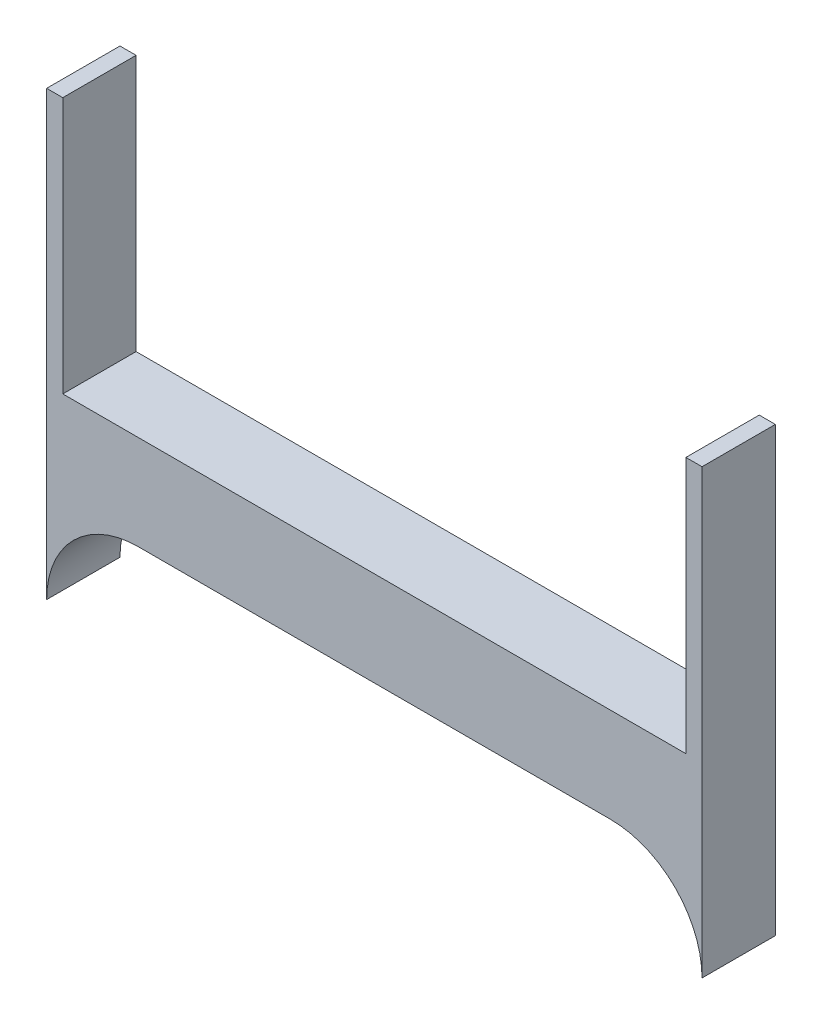
ISO-10303-21;
HEADER;
FILE_DESCRIPTION(('STEP AP214'),'2;1');
FILE_NAME('part.step','',(''),(''),'','','');
FILE_SCHEMA(('AUTOMOTIVE_DESIGN { 1 0 10303 214 1 1 1 1 }'));
ENDSEC;
DATA;
#1=APPLICATION_CONTEXT('core data for automotive mechanical design processes');
#2=APPLICATION_PROTOCOL_DEFINITION('international standard','automotive_design',2000,#1);
#3=PRODUCT_CONTEXT('',#1,'mechanical');
#4=PRODUCT('Part','Part','',(#3));
#5=PRODUCT_RELATED_PRODUCT_CATEGORY('part','',(#4));
#6=PRODUCT_DEFINITION_FORMATION('','',#4);
#7=PRODUCT_DEFINITION_CONTEXT('part definition',#1,'design');
#8=PRODUCT_DEFINITION('design','',#6,#7);
#9=PRODUCT_DEFINITION_SHAPE('','',#8);
#10=(LENGTH_UNIT() NAMED_UNIT(*) SI_UNIT(.MILLI.,.METRE.));
#11=(NAMED_UNIT(*) PLANE_ANGLE_UNIT() SI_UNIT($,.RADIAN.));
#12=(NAMED_UNIT(*) SI_UNIT($,.STERADIAN.) SOLID_ANGLE_UNIT());
#13=UNCERTAINTY_MEASURE_WITH_UNIT(LENGTH_MEASURE(1.E-05),#10,'distance_accuracy_value','');
#14=(GEOMETRIC_REPRESENTATION_CONTEXT(3) GLOBAL_UNCERTAINTY_ASSIGNED_CONTEXT((#13)) GLOBAL_UNIT_ASSIGNED_CONTEXT((#10,
#11,#12)) REPRESENTATION_CONTEXT('',''));
#15=CARTESIAN_POINT('',(0.,0.,0.));
#16=DIRECTION('',(0.,0.,1.));
#17=DIRECTION('',(1.,0.,0.));
#18=AXIS2_PLACEMENT_3D('',#15,#16,#17);
#19=CARTESIAN_POINT('',(1.25,-6.04,1.));
#20=DIRECTION('',(0.,0.,-1.));
#21=DIRECTION('',(-1.,0.,0.));
#22=AXIS2_PLACEMENT_3D('',#19,#20,#21);
#23=CYLINDRICAL_SURFACE('',#22,1.25);
#24=CARTESIAN_POINT('',(1.25,-6.04,0.));
#25=DIRECTION('',(0.,0.,-1.));
#26=DIRECTION('',(1.,0.,0.));
#27=AXIS2_PLACEMENT_3D('',#24,#25,#26);
#28=CIRCLE('',#27,1.25);
#29=CARTESIAN_POINT('',(0.,-6.04,0.));
#30=VERTEX_POINT('',#29);
#31=CARTESIAN_POINT('',(1.25,-4.79,0.));
#32=VERTEX_POINT('',#31);
#33=EDGE_CURVE('E158',#30,#32,#28,.T.);
#34=ORIENTED_EDGE('',*,*,#33,.T.);
#35=DIRECTION('',(0.,0.,-1.));
#36=VECTOR('',#35,1.);
#37=CARTESIAN_POINT('',(1.25,-4.79,1.));
#38=LINE('',#37,#36);
#39=CARTESIAN_POINT('',(1.25,-4.79,1.));
#40=VERTEX_POINT('',#39);
#41=EDGE_CURVE('E11',#40,#32,#38,.T.);
#42=ORIENTED_EDGE('',*,*,#41,.F.);
#43=CARTESIAN_POINT('',(1.25,-6.04,1.));
#44=DIRECTION('',(0.,0.,-1.));
#45=DIRECTION('',(1.,0.,0.));
#46=AXIS2_PLACEMENT_3D('',#43,#44,#45);
#47=CIRCLE('',#46,1.25);
#48=CARTESIAN_POINT('',(0.,-6.04,1.));
#49=VERTEX_POINT('',#48);
#50=EDGE_CURVE('E186',#49,#40,#47,.T.);
#51=ORIENTED_EDGE('',*,*,#50,.F.);
#52=DIRECTION('',(0.,0.,-1.));
#53=VECTOR('',#52,1.);
#54=CARTESIAN_POINT('',(0.,-6.04,1.));
#55=LINE('',#54,#53);
#56=EDGE_CURVE('E154',#49,#30,#55,.T.);
#57=ORIENTED_EDGE('',*,*,#56,.T.);
#58=EDGE_LOOP('',(#34,#42,#51,#57));
#59=FACE_BOUND('',#58,.T.);
#60=ADVANCED_FACE('F45',(#59),#23,.F.);
#61=CARTESIAN_POINT('',(1.25,-4.79,1.));
#62=DIRECTION('',(0.,1.,0.));
#63=DIRECTION('',(-1.,0.,0.));
#64=AXIS2_PLACEMENT_3D('',#61,#62,#63);
#65=PLANE('',#64);
#66=DIRECTION('',(1.,0.,0.));
#67=VECTOR('',#66,1.);
#68=CARTESIAN_POINT('',(1.25,-4.79,0.));
#69=LINE('',#68,#67);
#70=CARTESIAN_POINT('',(7.69,-4.79,0.));
#71=VERTEX_POINT('',#70);
#72=EDGE_CURVE('E162',#32,#71,#69,.T.);
#73=ORIENTED_EDGE('',*,*,#72,.T.);
#74=DIRECTION('',(0.,0.,-1.));
#75=VECTOR('',#74,1.);
#76=CARTESIAN_POINT('',(7.69,-4.79,1.));
#77=LINE('',#76,#75);
#78=CARTESIAN_POINT('',(7.69,-4.79,1.));
#79=VERTEX_POINT('',#78);
#80=EDGE_CURVE('E54',#79,#71,#77,.T.);
#81=ORIENTED_EDGE('',*,*,#80,.F.);
#82=DIRECTION('',(1.,0.,0.));
#83=VECTOR('',#82,1.);
#84=CARTESIAN_POINT('',(1.25,-4.79,1.));
#85=LINE('',#84,#83);
#86=EDGE_CURVE('E111',#40,#79,#85,.T.);
#87=ORIENTED_EDGE('',*,*,#86,.F.);
#88=ORIENTED_EDGE('',*,*,#41,.T.);
#89=EDGE_LOOP('',(#73,#81,#87,#88));
#90=FACE_BOUND('',#89,.T.);
#91=ADVANCED_FACE('F250',(#90),#65,.F.);
#92=CARTESIAN_POINT('',(7.69,-6.04,1.));
#93=DIRECTION('',(0.,0.,-1.));
#94=DIRECTION('',(-1.,0.,0.));
#95=AXIS2_PLACEMENT_3D('',#92,#93,#94);
#96=CYLINDRICAL_SURFACE('',#95,1.25);
#97=CARTESIAN_POINT('',(7.69,-6.04,0.));
#98=DIRECTION('',(0.,0.,-1.));
#99=DIRECTION('',(1.,0.,0.));
#100=AXIS2_PLACEMENT_3D('',#97,#98,#99);
#101=CIRCLE('',#100,1.25);
#102=CARTESIAN_POINT('',(8.94,-6.04,0.));
#103=VERTEX_POINT('',#102);
#104=EDGE_CURVE('E165',#71,#103,#101,.T.);
#105=ORIENTED_EDGE('',*,*,#104,.T.);
#106=DIRECTION('',(0.,0.,-1.));
#107=VECTOR('',#106,1.);
#108=CARTESIAN_POINT('',(8.94,-6.04,1.));
#109=LINE('',#108,#107);
#110=CARTESIAN_POINT('',(8.94,-6.04,1.));
#111=VERTEX_POINT('',#110);
#112=EDGE_CURVE('E205',#111,#103,#109,.T.);
#113=ORIENTED_EDGE('',*,*,#112,.F.);
#114=CARTESIAN_POINT('',(7.69,-6.04,1.));
#115=DIRECTION('',(0.,0.,-1.));
#116=DIRECTION('',(1.,0.,0.));
#117=AXIS2_PLACEMENT_3D('',#114,#115,#116);
#118=CIRCLE('',#117,1.25);
#119=EDGE_CURVE('E215',#79,#111,#118,.T.);
#120=ORIENTED_EDGE('',*,*,#119,.F.);
#121=ORIENTED_EDGE('',*,*,#80,.T.);
#122=EDGE_LOOP('',(#105,#113,#120,#121));
#123=FACE_BOUND('',#122,.T.);
#124=ADVANCED_FACE('F213',(#123),#96,.F.);
#125=CARTESIAN_POINT('',(8.94,0.,1.));
#126=DIRECTION('',(-1.,0.,0.));
#127=DIRECTION('',(0.,0.,1.));
#128=AXIS2_PLACEMENT_3D('',#125,#126,#127);
#129=PLANE('',#128);
#130=DIRECTION('',(0.,1.,0.));
#131=VECTOR('',#130,1.);
#132=CARTESIAN_POINT('',(8.94,0.,0.));
#133=LINE('',#132,#131);
#134=CARTESIAN_POINT('',(8.94,0.,0.));
#135=VERTEX_POINT('',#134);
#136=EDGE_CURVE('E168',#103,#135,#133,.T.);
#137=ORIENTED_EDGE('',*,*,#136,.T.);
#138=DIRECTION('',(0.,0.,-1.));
#139=VECTOR('',#138,1.);
#140=CARTESIAN_POINT('',(8.94,0.,1.));
#141=LINE('',#140,#139);
#142=CARTESIAN_POINT('',(8.94,0.,1.));
#143=VERTEX_POINT('',#142);
#144=EDGE_CURVE('E201',#143,#135,#141,.T.);
#145=ORIENTED_EDGE('',*,*,#144,.F.);
#146=DIRECTION('',(0.,1.,0.));
#147=VECTOR('',#146,1.);
#148=CARTESIAN_POINT('',(8.94,0.,1.));
#149=LINE('',#148,#147);
#150=EDGE_CURVE('E234',#111,#143,#149,.T.);
#151=ORIENTED_EDGE('',*,*,#150,.F.);
#152=ORIENTED_EDGE('',*,*,#112,.T.);
#153=EDGE_LOOP('',(#137,#145,#151,#152));
#154=FACE_BOUND('',#153,.T.);
#155=ADVANCED_FACE('F224',(#154),#129,.F.);
#156=CARTESIAN_POINT('',(8.72,0.,1.));
#157=DIRECTION('',(0.,-1.,0.));
#158=DIRECTION('',(1.,0.,0.));
#159=AXIS2_PLACEMENT_3D('',#156,#157,#158);
#160=PLANE('',#159);
#161=DIRECTION('',(-1.,0.,0.));
#162=VECTOR('',#161,1.);
#163=CARTESIAN_POINT('',(8.72,0.,0.));
#164=LINE('',#163,#162);
#165=CARTESIAN_POINT('',(8.72,0.,0.));
#166=VERTEX_POINT('',#165);
#167=EDGE_CURVE('E171',#135,#166,#164,.T.);
#168=ORIENTED_EDGE('',*,*,#167,.T.);
#169=DIRECTION('',(0.,0.,-1.));
#170=VECTOR('',#169,1.);
#171=CARTESIAN_POINT('',(8.72,0.,1.));
#172=LINE('',#171,#170);
#173=CARTESIAN_POINT('',(8.72,0.,1.));
#174=VERTEX_POINT('',#173);
#175=EDGE_CURVE('E197',#174,#166,#172,.T.);
#176=ORIENTED_EDGE('',*,*,#175,.F.);
#177=DIRECTION('',(-1.,0.,0.));
#178=VECTOR('',#177,1.);
#179=CARTESIAN_POINT('',(8.72,0.,1.));
#180=LINE('',#179,#178);
#181=EDGE_CURVE('E230',#143,#174,#180,.T.);
#182=ORIENTED_EDGE('',*,*,#181,.F.);
#183=ORIENTED_EDGE('',*,*,#144,.T.);
#184=EDGE_LOOP('',(#168,#176,#182,#183));
#185=FACE_BOUND('',#184,.T.);
#186=ADVANCED_FACE('F228',(#185),#160,.F.);
#187=CARTESIAN_POINT('',(8.72,0.,1.));
#188=DIRECTION('',(1.,0.,0.));
#189=DIRECTION('',(0.,0.,-1.));
#190=AXIS2_PLACEMENT_3D('',#187,#188,#189);
#191=PLANE('',#190);
#192=DIRECTION('',(0.,-1.,0.));
#193=VECTOR('',#192,1.);
#194=CARTESIAN_POINT('',(8.72,0.,0.));
#195=LINE('',#194,#193);
#196=CARTESIAN_POINT('',(8.72,-3.5,0.));
#197=VERTEX_POINT('',#196);
#198=EDGE_CURVE('E174',#166,#197,#195,.T.);
#199=ORIENTED_EDGE('',*,*,#198,.T.);
#200=DIRECTION('',(0.,0.,-1.));
#201=VECTOR('',#200,1.);
#202=CARTESIAN_POINT('',(8.72,-3.5,1.));
#203=LINE('',#202,#201);
#204=CARTESIAN_POINT('',(8.72,-3.5,1.));
#205=VERTEX_POINT('',#204);
#206=EDGE_CURVE('E193',#205,#197,#203,.T.);
#207=ORIENTED_EDGE('',*,*,#206,.F.);
#208=DIRECTION('',(0.,-1.,0.));
#209=VECTOR('',#208,1.);
#210=CARTESIAN_POINT('',(8.72,0.,1.));
#211=LINE('',#210,#209);
#212=EDGE_CURVE('E233',#174,#205,#211,.T.);
#213=ORIENTED_EDGE('',*,*,#212,.F.);
#214=ORIENTED_EDGE('',*,*,#175,.T.);
#215=EDGE_LOOP('',(#199,#207,#213,#214));
#216=FACE_BOUND('',#215,.T.);
#217=ADVANCED_FACE('F262',(#216),#191,.F.);
#218=CARTESIAN_POINT('',(0.22,-3.5,1.));
#219=DIRECTION('',(0.,-1.,0.));
#220=DIRECTION('',(0.,0.,-1.));
#221=AXIS2_PLACEMENT_3D('',#218,#219,#220);
#222=PLANE('',#221);
#223=DIRECTION('',(-1.,0.,0.));
#224=VECTOR('',#223,1.);
#225=CARTESIAN_POINT('',(0.22,-3.5,0.));
#226=LINE('',#225,#224);
#227=CARTESIAN_POINT('',(0.22,-3.5,0.));
#228=VERTEX_POINT('',#227);
#229=EDGE_CURVE('E177',#197,#228,#226,.T.);
#230=ORIENTED_EDGE('',*,*,#229,.T.);
#231=DIRECTION('',(0.,0.,-1.));
#232=VECTOR('',#231,1.);
#233=CARTESIAN_POINT('',(0.22,-3.5,1.));
#234=LINE('',#233,#232);
#235=CARTESIAN_POINT('',(0.22,-3.5,1.));
#236=VERTEX_POINT('',#235);
#237=EDGE_CURVE('E147',#236,#228,#234,.T.);
#238=ORIENTED_EDGE('',*,*,#237,.F.);
#239=DIRECTION('',(-1.,0.,0.));
#240=VECTOR('',#239,1.);
#241=CARTESIAN_POINT('',(0.22,-3.5,1.));
#242=LINE('',#241,#240);
#243=EDGE_CURVE('E136',#205,#236,#242,.T.);
#244=ORIENTED_EDGE('',*,*,#243,.F.);
#245=ORIENTED_EDGE('',*,*,#206,.T.);
#246=EDGE_LOOP('',(#230,#238,#244,#245));
#247=FACE_BOUND('',#246,.T.);
#248=ADVANCED_FACE('F265',(#247),#222,.F.);
#249=CARTESIAN_POINT('',(0.22,0.,1.));
#250=DIRECTION('',(-1.,0.,0.));
#251=DIRECTION('',(0.,-1.,0.));
#252=AXIS2_PLACEMENT_3D('',#249,#250,#251);
#253=PLANE('',#252);
#254=DIRECTION('',(0.,1.,0.));
#255=VECTOR('',#254,1.);
#256=CARTESIAN_POINT('',(0.22,0.,0.));
#257=LINE('',#256,#255);
#258=CARTESIAN_POINT('',(0.22,0.,0.));
#259=VERTEX_POINT('',#258);
#260=EDGE_CURVE('E145',#228,#259,#257,.T.);
#261=ORIENTED_EDGE('',*,*,#260,.T.);
#262=DIRECTION('',(0.,0.,-1.));
#263=VECTOR('',#262,1.);
#264=CARTESIAN_POINT('',(0.22,0.,1.));
#265=LINE('',#264,#263);
#266=CARTESIAN_POINT('',(0.22,0.,1.));
#267=VERTEX_POINT('',#266);
#268=EDGE_CURVE('E142',#267,#259,#265,.T.);
#269=ORIENTED_EDGE('',*,*,#268,.F.);
#270=DIRECTION('',(0.,1.,0.));
#271=VECTOR('',#270,1.);
#272=CARTESIAN_POINT('',(0.22,0.,1.));
#273=LINE('',#272,#271);
#274=EDGE_CURVE('E130',#236,#267,#273,.T.);
#275=ORIENTED_EDGE('',*,*,#274,.F.);
#276=ORIENTED_EDGE('',*,*,#237,.T.);
#277=EDGE_LOOP('',(#261,#269,#275,#276));
#278=FACE_BOUND('',#277,.T.);
#279=ADVANCED_FACE('F143',(#278),#253,.F.);
#280=CARTESIAN_POINT('',(0.,0.,1.));
#281=DIRECTION('',(0.,-1.,0.));
#282=DIRECTION('',(1.,0.,0.));
#283=AXIS2_PLACEMENT_3D('',#280,#281,#282);
#284=PLANE('',#283);
#285=DIRECTION('',(-1.,0.,0.));
#286=VECTOR('',#285,1.);
#287=CARTESIAN_POINT('',(0.,0.,0.));
#288=LINE('',#287,#286);
#289=CARTESIAN_POINT('',(0.,0.,0.));
#290=VERTEX_POINT('',#289);
#291=EDGE_CURVE('E97',#259,#290,#288,.T.);
#292=ORIENTED_EDGE('',*,*,#291,.T.);
#293=DIRECTION('',(0.,0.,-1.));
#294=VECTOR('',#293,1.);
#295=CARTESIAN_POINT('',(0.,0.,1.));
#296=LINE('',#295,#294);
#297=CARTESIAN_POINT('',(0.,0.,1.));
#298=VERTEX_POINT('',#297);
#299=EDGE_CURVE('E148',#298,#290,#296,.T.);
#300=ORIENTED_EDGE('',*,*,#299,.F.);
#301=DIRECTION('',(-1.,0.,0.));
#302=VECTOR('',#301,1.);
#303=CARTESIAN_POINT('',(0.,0.,1.));
#304=LINE('',#303,#302);
#305=EDGE_CURVE('E134',#267,#298,#304,.T.);
#306=ORIENTED_EDGE('',*,*,#305,.F.);
#307=ORIENTED_EDGE('',*,*,#268,.T.);
#308=EDGE_LOOP('',(#292,#300,#306,#307));
#309=FACE_BOUND('',#308,.T.);
#310=ADVANCED_FACE('F150',(#309),#284,.F.);
#311=CARTESIAN_POINT('',(0.,-6.04,1.));
#312=DIRECTION('',(1.,0.,0.));
#313=DIRECTION('',(0.,0.,-1.));
#314=AXIS2_PLACEMENT_3D('',#311,#312,#313);
#315=PLANE('',#314);
#316=DIRECTION('',(0.,-1.,0.));
#317=VECTOR('',#316,1.);
#318=CARTESIAN_POINT('',(0.,-6.04,0.));
#319=LINE('',#318,#317);
#320=EDGE_CURVE('E103',#290,#30,#319,.T.);
#321=ORIENTED_EDGE('',*,*,#320,.T.);
#322=ORIENTED_EDGE('',*,*,#56,.F.);
#323=DIRECTION('',(0.,-1.,0.));
#324=VECTOR('',#323,1.);
#325=CARTESIAN_POINT('',(0.,-6.04,1.));
#326=LINE('',#325,#324);
#327=EDGE_CURVE('E62',#298,#49,#326,.T.);
#328=ORIENTED_EDGE('',*,*,#327,.F.);
#329=ORIENTED_EDGE('',*,*,#299,.T.);
#330=EDGE_LOOP('',(#321,#322,#328,#329));
#331=FACE_BOUND('',#330,.T.);
#332=ADVANCED_FACE('F274',(#331),#315,.F.);
#333=CARTESIAN_POINT('',(1.25,-6.04,1.));
#334=DIRECTION('',(0.,0.,1.));
#335=DIRECTION('',(1.,0.,0.));
#336=AXIS2_PLACEMENT_3D('',#333,#334,#335);
#337=PLANE('',#336);
#338=ORIENTED_EDGE('',*,*,#50,.T.);
#339=ORIENTED_EDGE('',*,*,#86,.T.);
#340=ORIENTED_EDGE('',*,*,#119,.T.);
#341=ORIENTED_EDGE('',*,*,#150,.T.);
#342=ORIENTED_EDGE('',*,*,#181,.T.);
#343=ORIENTED_EDGE('',*,*,#212,.T.);
#344=ORIENTED_EDGE('',*,*,#243,.T.);
#345=ORIENTED_EDGE('',*,*,#274,.T.);
#346=ORIENTED_EDGE('',*,*,#305,.T.);
#347=ORIENTED_EDGE('',*,*,#327,.T.);
#348=EDGE_LOOP('',(#338,#339,#340,#341,#342,#343,#344,#345,#346,#347));
#349=FACE_BOUND('',#348,.T.);
#350=ADVANCED_FACE('F132',(#349),#337,.T.);
#351=CARTESIAN_POINT('',(1.25,-6.04,0.));
#352=DIRECTION('',(0.,0.,1.));
#353=DIRECTION('',(1.,0.,0.));
#354=AXIS2_PLACEMENT_3D('',#351,#352,#353);
#355=PLANE('',#354);
#356=ORIENTED_EDGE('',*,*,#33,.F.);
#357=ORIENTED_EDGE('',*,*,#320,.F.);
#358=ORIENTED_EDGE('',*,*,#291,.F.);
#359=ORIENTED_EDGE('',*,*,#260,.F.);
#360=ORIENTED_EDGE('',*,*,#229,.F.);
#361=ORIENTED_EDGE('',*,*,#198,.F.);
#362=ORIENTED_EDGE('',*,*,#167,.F.);
#363=ORIENTED_EDGE('',*,*,#136,.F.);
#364=ORIENTED_EDGE('',*,*,#104,.F.);
#365=ORIENTED_EDGE('',*,*,#72,.F.);
#366=EDGE_LOOP('',(#356,#357,#358,#359,#360,#361,#362,#363,#364,#365));
#367=FACE_BOUND('',#366,.T.);
#368=ADVANCED_FACE('F219',(#367),#355,.F.);
#369=CLOSED_SHELL('',(#60,#91,#124,#155,#186,#217,#248,#279,#310,#332,#350,#368));
#370=MANIFOLD_SOLID_BREP('B2',#369);
#371=ADVANCED_BREP_SHAPE_REPRESENTATION('',(#18,#370),#14);
#372=SHAPE_DEFINITION_REPRESENTATION(#9,#371);
ENDSEC;
END-ISO-10303-21;
